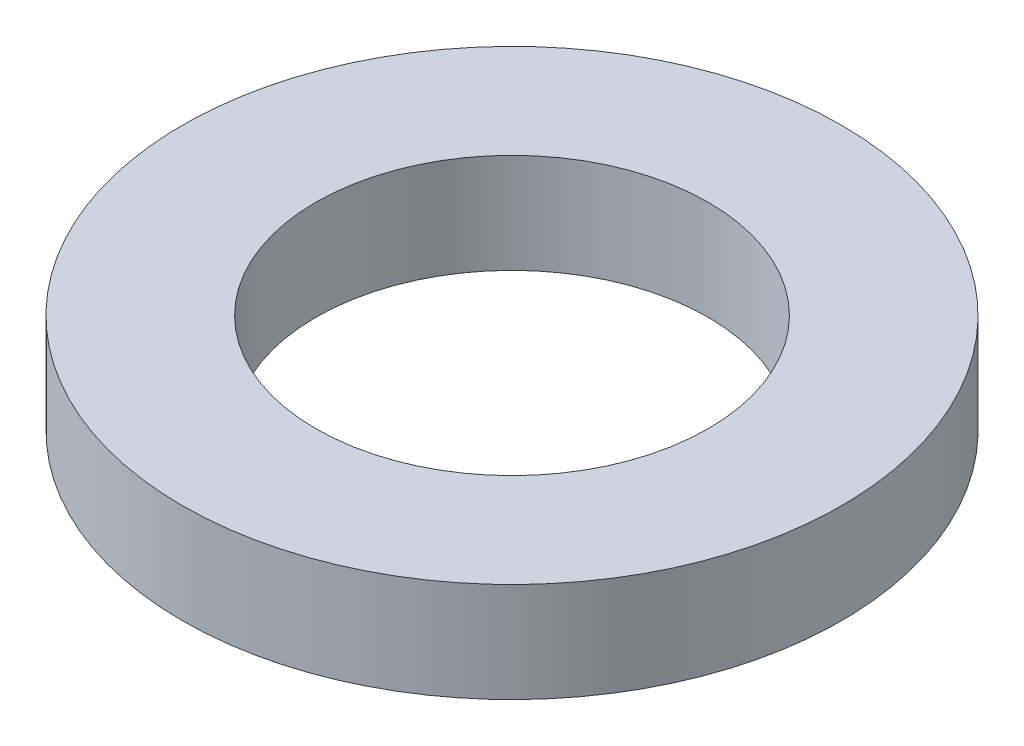
ISO-10303-21;
HEADER;
FILE_DESCRIPTION(('STEP AP214'),'2;1');
FILE_NAME('part.step','',(''),(''),'','','');
FILE_SCHEMA(('AUTOMOTIVE_DESIGN { 1 0 10303 214 1 1 1 1 }'));
ENDSEC;
DATA;
#1=APPLICATION_CONTEXT('core data for automotive mechanical design processes');
#2=APPLICATION_PROTOCOL_DEFINITION('international standard','automotive_design',2000,#1);
#3=PRODUCT_CONTEXT('',#1,'mechanical');
#4=PRODUCT('Part','Part','',(#3));
#5=PRODUCT_RELATED_PRODUCT_CATEGORY('part','',(#4));
#6=PRODUCT_DEFINITION_FORMATION('','',#4);
#7=PRODUCT_DEFINITION_CONTEXT('part definition',#1,'design');
#8=PRODUCT_DEFINITION('design','',#6,#7);
#9=PRODUCT_DEFINITION_SHAPE('','',#8);
#10=(LENGTH_UNIT() NAMED_UNIT(*) SI_UNIT(.MILLI.,.METRE.));
#11=(NAMED_UNIT(*) PLANE_ANGLE_UNIT() SI_UNIT($,.RADIAN.));
#12=(NAMED_UNIT(*) SI_UNIT($,.STERADIAN.) SOLID_ANGLE_UNIT());
#13=UNCERTAINTY_MEASURE_WITH_UNIT(LENGTH_MEASURE(1.E-05),#10,'distance_accuracy_value','');
#14=(GEOMETRIC_REPRESENTATION_CONTEXT(3) GLOBAL_UNCERTAINTY_ASSIGNED_CONTEXT((#13)) GLOBAL_UNIT_ASSIGNED_CONTEXT((#10,
#11,#12)) REPRESENTATION_CONTEXT('',''));
#15=CARTESIAN_POINT('',(0.,0.,0.));
#16=DIRECTION('',(0.,0.,1.));
#17=DIRECTION('',(1.,0.,0.));
#18=AXIS2_PLACEMENT_3D('',#15,#16,#17);
#19=CARTESIAN_POINT('',(0.,1.27,0.));
#20=DIRECTION('',(0.,1.,0.));
#21=DIRECTION('',(0.,0.,1.));
#22=AXIS2_PLACEMENT_3D('',#19,#20,#21);
#23=PLANE('',#22);
#24=CARTESIAN_POINT('',(0.,1.27,0.));
#25=DIRECTION('',(0.,1.,0.));
#26=DIRECTION('',(0.,0.,1.));
#27=AXIS2_PLACEMENT_3D('',#24,#25,#26);
#28=CIRCLE('',#27,4.2);
#29=CARTESIAN_POINT('',(0.,1.27,4.2));
#30=VERTEX_POINT('',#29);
#31=EDGE_CURVE('E10',#30,#30,#28,.T.);
#32=ORIENTED_EDGE('',*,*,#31,.T.);
#33=EDGE_LOOP('',(#32));
#34=FACE_BOUND('',#33,.T.);
#35=CARTESIAN_POINT('',(0.,1.27,0.));
#36=DIRECTION('',(0.,1.,0.));
#37=DIRECTION('',(0.,0.,1.));
#38=AXIS2_PLACEMENT_3D('',#35,#36,#37);
#39=CIRCLE('',#38,2.5);
#40=CARTESIAN_POINT('',(0.,1.27,2.5));
#41=VERTEX_POINT('',#40);
#42=EDGE_CURVE('E56',#41,#41,#39,.T.);
#43=ORIENTED_EDGE('',*,*,#42,.F.);
#44=EDGE_LOOP('',(#43));
#45=FACE_BOUND('',#44,.T.);
#46=ADVANCED_FACE('F43',(#34,#45),#23,.T.);
#47=CARTESIAN_POINT('',(0.,0.,0.));
#48=DIRECTION('',(0.,1.,0.));
#49=DIRECTION('',(0.,0.,1.));
#50=AXIS2_PLACEMENT_3D('',#47,#48,#49);
#51=PLANE('',#50);
#52=CARTESIAN_POINT('',(0.,0.,0.));
#53=DIRECTION('',(0.,1.,0.));
#54=DIRECTION('',(0.,0.,1.));
#55=AXIS2_PLACEMENT_3D('',#52,#53,#54);
#56=CIRCLE('',#55,4.2);
#57=CARTESIAN_POINT('',(0.,0.,4.2));
#58=VERTEX_POINT('',#57);
#59=EDGE_CURVE('E47',#58,#58,#56,.T.);
#60=ORIENTED_EDGE('',*,*,#59,.F.);
#61=EDGE_LOOP('',(#60));
#62=FACE_BOUND('',#61,.T.);
#63=CARTESIAN_POINT('',(0.,0.,0.));
#64=DIRECTION('',(0.,1.,0.));
#65=DIRECTION('',(0.,0.,1.));
#66=AXIS2_PLACEMENT_3D('',#63,#64,#65);
#67=CIRCLE('',#66,2.5);
#68=CARTESIAN_POINT('',(0.,0.,2.5));
#69=VERTEX_POINT('',#68);
#70=EDGE_CURVE('E58',#69,#69,#67,.T.);
#71=ORIENTED_EDGE('',*,*,#70,.T.);
#72=EDGE_LOOP('',(#71));
#73=FACE_BOUND('',#72,.T.);
#74=ADVANCED_FACE('F70',(#62,#73),#51,.F.);
#75=CARTESIAN_POINT('',(0.,1.27,0.));
#76=DIRECTION('',(0.,-1.,0.));
#77=DIRECTION('',(0.,0.,-1.));
#78=AXIS2_PLACEMENT_3D('',#75,#76,#77);
#79=CYLINDRICAL_SURFACE('',#78,4.2);
#80=ORIENTED_EDGE('',*,*,#31,.F.);
#81=EDGE_LOOP('',(#80));
#82=FACE_BOUND('',#81,.T.);
#83=ORIENTED_EDGE('',*,*,#59,.T.);
#84=EDGE_LOOP('',(#83));
#85=FACE_BOUND('',#84,.T.);
#86=ADVANCED_FACE('F45',(#82,#85),#79,.T.);
#87=CARTESIAN_POINT('',(0.,1.27,0.));
#88=DIRECTION('',(0.,-1.,0.));
#89=DIRECTION('',(0.,0.,-1.));
#90=AXIS2_PLACEMENT_3D('',#87,#88,#89);
#91=CYLINDRICAL_SURFACE('',#90,2.5);
#92=ORIENTED_EDGE('',*,*,#42,.T.);
#93=EDGE_LOOP('',(#92));
#94=FACE_BOUND('',#93,.T.);
#95=ORIENTED_EDGE('',*,*,#70,.F.);
#96=EDGE_LOOP('',(#95));
#97=FACE_BOUND('',#96,.T.);
#98=ADVANCED_FACE('F66',(#94,#97),#91,.F.);
#99=CLOSED_SHELL('',(#46,#74,#86,#98));
#100=MANIFOLD_SOLID_BREP('B2',#99);
#101=ADVANCED_BREP_SHAPE_REPRESENTATION('',(#18,#100),#14);
#102=SHAPE_DEFINITION_REPRESENTATION(#9,#101);
ENDSEC;
END-ISO-10303-21;
